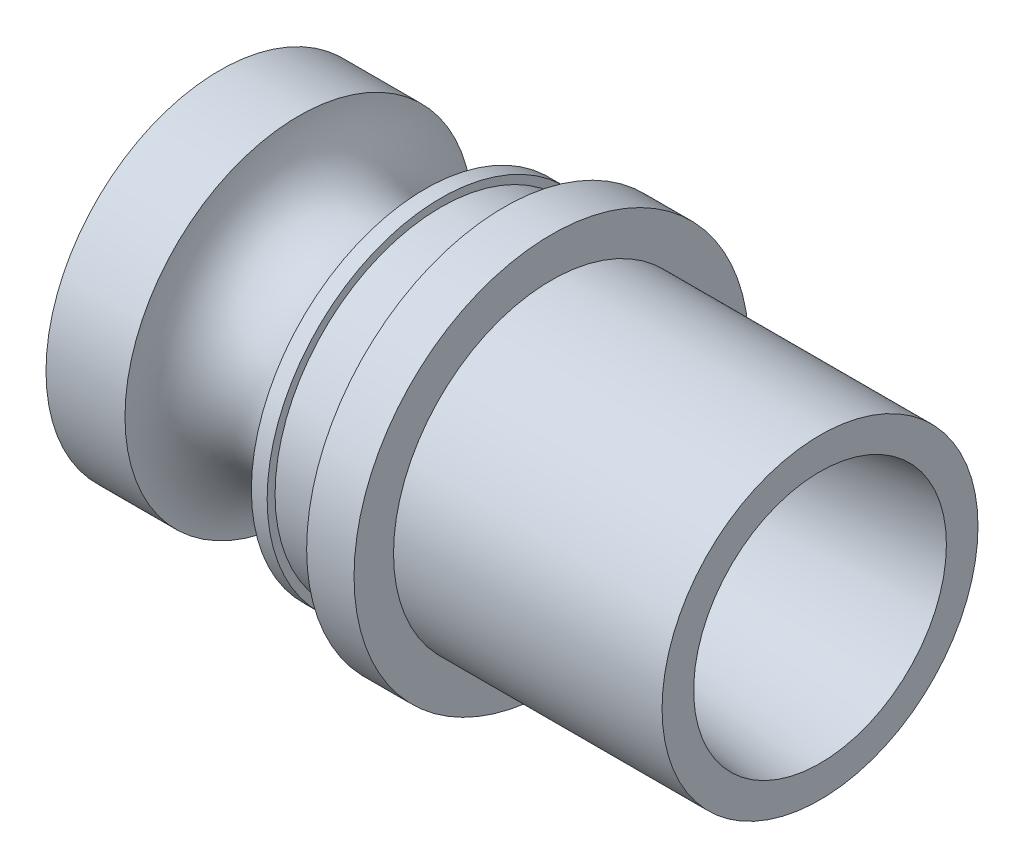
ISO-10303-21;
HEADER;
FILE_DESCRIPTION(('STEP AP214'),'2;1');
FILE_NAME('part.step','',(''),(''),'','','');
FILE_SCHEMA(('AUTOMOTIVE_DESIGN { 1 0 10303 214 1 1 1 1 }'));
ENDSEC;
DATA;
#1=APPLICATION_CONTEXT('core data for automotive mechanical design processes');
#2=APPLICATION_PROTOCOL_DEFINITION('international standard','automotive_design',2000,#1);
#3=PRODUCT_CONTEXT('',#1,'mechanical');
#4=PRODUCT('Part','Part','',(#3));
#5=PRODUCT_RELATED_PRODUCT_CATEGORY('part','',(#4));
#6=PRODUCT_DEFINITION_FORMATION('','',#4);
#7=PRODUCT_DEFINITION_CONTEXT('part definition',#1,'design');
#8=PRODUCT_DEFINITION('design','',#6,#7);
#9=PRODUCT_DEFINITION_SHAPE('','',#8);
#10=(LENGTH_UNIT() NAMED_UNIT(*) SI_UNIT(.MILLI.,.METRE.));
#11=(NAMED_UNIT(*) PLANE_ANGLE_UNIT() SI_UNIT($,.RADIAN.));
#12=(NAMED_UNIT(*) SI_UNIT($,.STERADIAN.) SOLID_ANGLE_UNIT());
#13=UNCERTAINTY_MEASURE_WITH_UNIT(LENGTH_MEASURE(1.E-05),#10,'distance_accuracy_value','');
#14=(GEOMETRIC_REPRESENTATION_CONTEXT(3) GLOBAL_UNCERTAINTY_ASSIGNED_CONTEXT((#13)) GLOBAL_UNIT_ASSIGNED_CONTEXT((#10,
#11,#12)) REPRESENTATION_CONTEXT('',''));
#15=CARTESIAN_POINT('',(0.,0.,0.));
#16=DIRECTION('',(0.,0.,1.));
#17=DIRECTION('',(1.,0.,0.));
#18=AXIS2_PLACEMENT_3D('',#15,#16,#17);
#19=CARTESIAN_POINT('',(-2.23174603174603,0.,0.));
#20=DIRECTION('',(1.,0.,0.));
#21=DIRECTION('',(0.,0.,-1.));
#22=AXIS2_PLACEMENT_3D('',#19,#20,#21);
#23=CYLINDRICAL_SURFACE('',#22,5.5);
#24=CARTESIAN_POINT('',(-14.731746031746,0.,0.));
#25=DIRECTION('',(-1.,0.,0.));
#26=DIRECTION('',(0.,0.,1.));
#27=AXIS2_PLACEMENT_3D('',#24,#25,#26);
#28=CIRCLE('',#27,5.5);
#29=CARTESIAN_POINT('',(-14.731746031746,0.,5.5));
#30=VERTEX_POINT('',#29);
#31=EDGE_CURVE('E42',#30,#30,#28,.T.);
#32=ORIENTED_EDGE('',*,*,#31,.F.);
#33=EDGE_LOOP('',(#32));
#34=FACE_BOUND('',#33,.T.);
#35=CARTESIAN_POINT('',(-14.231746031746,0.,0.));
#36=DIRECTION('',(1.,0.,0.));
#37=DIRECTION('',(0.,0.,-1.));
#38=AXIS2_PLACEMENT_3D('',#35,#36,#37);
#39=CIRCLE('',#38,5.5);
#40=CARTESIAN_POINT('',(-14.231746031746,0.,-5.5));
#41=VERTEX_POINT('',#40);
#42=EDGE_CURVE('E47',#41,#41,#39,.T.);
#43=ORIENTED_EDGE('',*,*,#42,.F.);
#44=EDGE_LOOP('',(#43));
#45=FACE_BOUND('',#44,.T.);
#46=ADVANCED_FACE('F38',(#34,#45),#23,.T.);
#47=CARTESIAN_POINT('',(-2.23174603174603,5.,0.));
#48=DIRECTION('',(1.,0.,0.));
#49=DIRECTION('',(0.,0.,-1.));
#50=AXIS2_PLACEMENT_3D('',#47,#48,#49);
#51=PLANE('',#50);
#52=CARTESIAN_POINT('',(-2.23174603174603,0.,0.));
#53=DIRECTION('',(1.,0.,0.));
#54=DIRECTION('',(0.,0.,-1.));
#55=AXIS2_PLACEMENT_3D('',#52,#53,#54);
#56=CIRCLE('',#55,4.);
#57=CARTESIAN_POINT('',(-2.23174603174603,0.,-4.));
#58=VERTEX_POINT('',#57);
#59=EDGE_CURVE('E272',#58,#58,#56,.T.);
#60=ORIENTED_EDGE('',*,*,#59,.F.);
#61=EDGE_LOOP('',(#60));
#62=FACE_BOUND('',#61,.T.);
#63=CARTESIAN_POINT('',(-2.23174603174603,0.,0.));
#64=DIRECTION('',(1.,0.,0.));
#65=DIRECTION('',(0.,0.,-1.));
#66=AXIS2_PLACEMENT_3D('',#63,#64,#65);
#67=CIRCLE('',#66,5.);
#68=CARTESIAN_POINT('',(-2.23174603174603,0.,-5.));
#69=VERTEX_POINT('',#68);
#70=EDGE_CURVE('E65',#69,#69,#67,.T.);
#71=ORIENTED_EDGE('',*,*,#70,.T.);
#72=EDGE_LOOP('',(#71));
#73=FACE_BOUND('',#72,.T.);
#74=ADVANCED_FACE('F40',(#62,#73),#51,.T.);
#75=CARTESIAN_POINT('',(-14.231746031746,5.5,0.));
#76=DIRECTION('',(1.,0.,0.));
#77=DIRECTION('',(0.,0.,-1.));
#78=AXIS2_PLACEMENT_3D('',#75,#76,#77);
#79=PLANE('',#78);
#80=ORIENTED_EDGE('',*,*,#42,.T.);
#81=EDGE_LOOP('',(#80));
#82=FACE_BOUND('',#81,.T.);
#83=CARTESIAN_POINT('',(-14.231746031746,0.,0.));
#84=DIRECTION('',(1.,0.,0.));
#85=DIRECTION('',(0.,0.,-1.));
#86=AXIS2_PLACEMENT_3D('',#83,#84,#85);
#87=CIRCLE('',#86,5.25);
#88=CARTESIAN_POINT('',(-14.231746031746,0.,-5.25));
#89=VERTEX_POINT('',#88);
#90=EDGE_CURVE('E53',#89,#89,#87,.T.);
#91=ORIENTED_EDGE('',*,*,#90,.F.);
#92=EDGE_LOOP('',(#91));
#93=FACE_BOUND('',#92,.T.);
#94=ADVANCED_FACE('F102',(#82,#93),#79,.T.);
#95=CARTESIAN_POINT('',(-2.23174603174603,0.,0.));
#96=DIRECTION('',(1.,0.,0.));
#97=DIRECTION('',(0.,0.,-1.));
#98=AXIS2_PLACEMENT_3D('',#95,#96,#97);
#99=CYLINDRICAL_SURFACE('',#98,5.25);
#100=ORIENTED_EDGE('',*,*,#90,.T.);
#101=EDGE_LOOP('',(#100));
#102=FACE_BOUND('',#101,.T.);
#103=CARTESIAN_POINT('',(-12.231746031746,0.,0.));
#104=DIRECTION('',(1.,0.,0.));
#105=DIRECTION('',(0.,0.,-1.));
#106=AXIS2_PLACEMENT_3D('',#103,#104,#105);
#107=CIRCLE('',#106,5.25);
#108=CARTESIAN_POINT('',(-12.231746031746,0.,-5.25));
#109=VERTEX_POINT('',#108);
#110=EDGE_CURVE('E92',#109,#109,#107,.T.);
#111=ORIENTED_EDGE('',*,*,#110,.F.);
#112=EDGE_LOOP('',(#111));
#113=FACE_BOUND('',#112,.T.);
#114=ADVANCED_FACE('F99',(#102,#113),#99,.T.);
#115=CARTESIAN_POINT('',(-12.231746031746,5.25,0.));
#116=DIRECTION('',(-1.,0.,0.));
#117=DIRECTION('',(0.,0.,1.));
#118=AXIS2_PLACEMENT_3D('',#115,#116,#117);
#119=PLANE('',#118);
#120=ORIENTED_EDGE('',*,*,#110,.T.);
#121=EDGE_LOOP('',(#120));
#122=FACE_BOUND('',#121,.T.);
#123=CARTESIAN_POINT('',(-12.231746031746,0.,0.));
#124=DIRECTION('',(1.,0.,0.));
#125=DIRECTION('',(0.,0.,-1.));
#126=AXIS2_PLACEMENT_3D('',#123,#124,#125);
#127=CIRCLE('',#126,6.25);
#128=CARTESIAN_POINT('',(-12.231746031746,0.,-6.25));
#129=VERTEX_POINT('',#128);
#130=EDGE_CURVE('E88',#129,#129,#127,.T.);
#131=ORIENTED_EDGE('',*,*,#130,.F.);
#132=EDGE_LOOP('',(#131));
#133=FACE_BOUND('',#132,.T.);
#134=ADVANCED_FACE('F110',(#122,#133),#119,.T.);
#135=CARTESIAN_POINT('',(-2.23174603174603,0.,0.));
#136=DIRECTION('',(1.,0.,0.));
#137=DIRECTION('',(0.,0.,-1.));
#138=AXIS2_PLACEMENT_3D('',#135,#136,#137);
#139=CYLINDRICAL_SURFACE('',#138,6.25);
#140=ORIENTED_EDGE('',*,*,#130,.T.);
#141=EDGE_LOOP('',(#140));
#142=FACE_BOUND('',#141,.T.);
#143=CARTESIAN_POINT('',(-10.731746031746,0.,0.));
#144=DIRECTION('',(1.,0.,0.));
#145=DIRECTION('',(0.,0.,-1.));
#146=AXIS2_PLACEMENT_3D('',#143,#144,#145);
#147=CIRCLE('',#146,6.25);
#148=CARTESIAN_POINT('',(-10.731746031746,0.,-6.25));
#149=VERTEX_POINT('',#148);
#150=EDGE_CURVE('E84',#149,#149,#147,.T.);
#151=ORIENTED_EDGE('',*,*,#150,.F.);
#152=EDGE_LOOP('',(#151));
#153=FACE_BOUND('',#152,.T.);
#154=ADVANCED_FACE('F159',(#142,#153),#139,.T.);
#155=CARTESIAN_POINT('',(-10.731746031746,6.25,0.));
#156=DIRECTION('',(1.,0.,0.));
#157=DIRECTION('',(0.,0.,-1.));
#158=AXIS2_PLACEMENT_3D('',#155,#156,#157);
#159=PLANE('',#158);
#160=ORIENTED_EDGE('',*,*,#150,.T.);
#161=EDGE_LOOP('',(#160));
#162=FACE_BOUND('',#161,.T.);
#163=CARTESIAN_POINT('',(-10.731746031746,0.,0.));
#164=DIRECTION('',(1.,0.,0.));
#165=DIRECTION('',(0.,0.,-1.));
#166=AXIS2_PLACEMENT_3D('',#163,#164,#165);
#167=CIRCLE('',#166,5.);
#168=CARTESIAN_POINT('',(-10.731746031746,0.,-5.));
#169=VERTEX_POINT('',#168);
#170=EDGE_CURVE('E80',#169,#169,#167,.T.);
#171=ORIENTED_EDGE('',*,*,#170,.F.);
#172=EDGE_LOOP('',(#171));
#173=FACE_BOUND('',#172,.T.);
#174=ADVANCED_FACE('F155',(#162,#173),#159,.T.);
#175=CARTESIAN_POINT('',(-2.23174603174603,0.,0.));
#176=DIRECTION('',(1.,0.,0.));
#177=DIRECTION('',(0.,0.,-1.));
#178=AXIS2_PLACEMENT_3D('',#175,#176,#177);
#179=CYLINDRICAL_SURFACE('',#178,5.);
#180=ORIENTED_EDGE('',*,*,#170,.T.);
#181=EDGE_LOOP('',(#180));
#182=FACE_BOUND('',#181,.T.);
#183=ORIENTED_EDGE('',*,*,#70,.F.);
#184=EDGE_LOOP('',(#183));
#185=FACE_BOUND('',#184,.T.);
#186=ADVANCED_FACE('F152',(#182,#185),#179,.T.);
#187=CARTESIAN_POINT('',(-16.731746031746,0.,0.));
#188=DIRECTION('',(1.,0.,0.));
#189=DIRECTION('',(0.,0.,-1.));
#190=AXIS2_PLACEMENT_3D('',#187,#188,#189);
#191=TOROIDAL_SURFACE('',#190,5.5,2.);
#192=ORIENTED_EDGE('',*,*,#31,.T.);
#193=EDGE_LOOP('',(#192));
#194=FACE_BOUND('',#193,.T.);
#195=CARTESIAN_POINT('',(-18.731746031746,0.,0.));
#196=DIRECTION('',(1.,0.,0.));
#197=DIRECTION('',(0.,0.,-1.));
#198=AXIS2_PLACEMENT_3D('',#195,#196,#197);
#199=CIRCLE('',#198,5.5);
#200=CARTESIAN_POINT('',(-18.731746031746,0.,-5.5));
#201=VERTEX_POINT('',#200);
#202=EDGE_CURVE('E56',#201,#201,#199,.T.);
#203=ORIENTED_EDGE('',*,*,#202,.T.);
#204=EDGE_LOOP('',(#203));
#205=FACE_BOUND('',#204,.T.);
#206=ADVANCED_FACE('F143',(#194,#205),#191,.F.);
#207=CARTESIAN_POINT('',(-21.8472926980596,0.,0.));
#208=DIRECTION('',(1.,0.,0.));
#209=DIRECTION('',(0.,0.,-1.));
#210=AXIS2_PLACEMENT_3D('',#207,#208,#209);
#211=DEGENERATE_TOROIDAL_SURFACE('',#210,0.0773120453172603,5.,.T.);
#212=CARTESIAN_POINT('',(-21.231746031746,0.,0.));
#213=DIRECTION('',(1.,0.,0.));
#214=DIRECTION('',(0.,0.,-1.));
#215=AXIS2_PLACEMENT_3D('',#212,#213,#214);
#216=CIRCLE('',#215,5.03927761367727);
#217=CARTESIAN_POINT('',(-21.231746031746,0.,-5.03927761367727));
#218=VERTEX_POINT('',#217);
#219=EDGE_CURVE('E59',#218,#218,#216,.T.);
#220=ORIENTED_EDGE('',*,*,#219,.F.);
#221=EDGE_LOOP('',(#220));
#222=FACE_BOUND('',#221,.T.);
#223=CARTESIAN_POINT('',(-17.231746031746,0.,0.));
#224=DIRECTION('',(1.,0.,0.));
#225=DIRECTION('',(0.,0.,-1.));
#226=AXIS2_PLACEMENT_3D('',#223,#224,#225);
#227=CIRCLE('',#226,2.);
#228=CARTESIAN_POINT('',(-17.231746031746,0.,-2.));
#229=VERTEX_POINT('',#228);
#230=EDGE_CURVE('E67',#229,#229,#227,.T.);
#231=ORIENTED_EDGE('',*,*,#230,.T.);
#232=EDGE_LOOP('',(#231));
#233=FACE_BOUND('',#232,.T.);
#234=ADVANCED_FACE('F147',(#222,#233),#211,.F.);
#235=CARTESIAN_POINT('',(-2.23174603174603,0.,0.));
#236=DIRECTION('',(1.,0.,0.));
#237=DIRECTION('',(0.,0.,-1.));
#238=AXIS2_PLACEMENT_3D('',#235,#236,#237);
#239=CYLINDRICAL_SURFACE('',#238,2.);
#240=ORIENTED_EDGE('',*,*,#230,.F.);
#241=EDGE_LOOP('',(#240));
#242=FACE_BOUND('',#241,.T.);
#243=CARTESIAN_POINT('',(-15.6088228534803,0.,0.));
#244=DIRECTION('',(1.,0.,0.));
#245=DIRECTION('',(0.,0.,-1.));
#246=AXIS2_PLACEMENT_3D('',#243,#244,#245);
#247=CIRCLE('',#246,2.);
#248=CARTESIAN_POINT('',(-15.6088228534803,0.,-2.));
#249=VERTEX_POINT('',#248);
#250=EDGE_CURVE('E73',#249,#249,#247,.T.);
#251=ORIENTED_EDGE('',*,*,#250,.T.);
#252=EDGE_LOOP('',(#251));
#253=FACE_BOUND('',#252,.T.);
#254=ADVANCED_FACE('F137',(#242,#253),#239,.F.);
#255=CARTESIAN_POINT('',(-15.231746031746,0.,0.));
#256=DIRECTION('',(1.,0.,0.));
#257=DIRECTION('',(0.,0.,-1.));
#258=AXIS2_PLACEMENT_3D('',#255,#256,#257);
#259=CONICAL_SURFACE('',#258,2.5188370920787,0.94232692660653);
#260=ORIENTED_EDGE('',*,*,#250,.F.);
#261=EDGE_LOOP('',(#260));
#262=FACE_BOUND('',#261,.T.);
#263=CARTESIAN_POINT('',(-15.231746031746,0.,0.));
#264=DIRECTION('',(1.,0.,0.));
#265=DIRECTION('',(0.,0.,-1.));
#266=AXIS2_PLACEMENT_3D('',#263,#264,#265);
#267=CIRCLE('',#266,2.5188370920787);
#268=CARTESIAN_POINT('',(-15.231746031746,0.,-2.5188370920787));
#269=VERTEX_POINT('',#268);
#270=EDGE_CURVE('E269',#269,#269,#267,.T.);
#271=ORIENTED_EDGE('',*,*,#270,.T.);
#272=EDGE_LOOP('',(#271));
#273=FACE_BOUND('',#272,.T.);
#274=ADVANCED_FACE('F131',(#262,#273),#259,.F.);
#275=CARTESIAN_POINT('',(-2.23174603174603,0.,0.));
#276=DIRECTION('',(1.,0.,0.));
#277=DIRECTION('',(0.,0.,-1.));
#278=AXIS2_PLACEMENT_3D('',#275,#276,#277);
#279=CONICAL_SURFACE('',#278,4.,0.113446401379625);
#280=ORIENTED_EDGE('',*,*,#270,.F.);
#281=EDGE_LOOP('',(#280));
#282=FACE_BOUND('',#281,.T.);
#283=ORIENTED_EDGE('',*,*,#59,.T.);
#284=EDGE_LOOP('',(#283));
#285=FACE_BOUND('',#284,.T.);
#286=ADVANCED_FACE('F125',(#282,#285),#279,.F.);
#287=ORIENTED_EDGE('',*,*,#202,.F.);
#288=EDGE_LOOP('',(#287));
#289=FACE_BOUND('',#288,.T.);
#290=CARTESIAN_POINT('',(-21.231746031746,0.,0.));
#291=DIRECTION('',(1.,0.,0.));
#292=DIRECTION('',(0.,0.,-1.));
#293=AXIS2_PLACEMENT_3D('',#290,#291,#292);
#294=CIRCLE('',#293,5.5);
#295=CARTESIAN_POINT('',(-21.231746031746,0.,-5.5));
#296=VERTEX_POINT('',#295);
#297=EDGE_CURVE('E10',#296,#296,#294,.T.);
#298=ORIENTED_EDGE('',*,*,#297,.T.);
#299=EDGE_LOOP('',(#298));
#300=FACE_BOUND('',#299,.T.);
#301=ADVANCED_FACE('F117',(#289,#300),#23,.T.);
#302=CARTESIAN_POINT('',(-21.231746031746,0.,0.));
#303=DIRECTION('',(-1.,0.,0.));
#304=DIRECTION('',(0.,0.,1.));
#305=AXIS2_PLACEMENT_3D('',#302,#303,#304);
#306=PLANE('',#305);
#307=ORIENTED_EDGE('',*,*,#219,.T.);
#308=EDGE_LOOP('',(#307));
#309=FACE_BOUND('',#308,.T.);
#310=ORIENTED_EDGE('',*,*,#297,.F.);
#311=EDGE_LOOP('',(#310));
#312=FACE_BOUND('',#311,.T.);
#313=ADVANCED_FACE('F124',(#309,#312),#306,.T.);
#314=CLOSED_SHELL('',(#46,#74,#94,#114,#134,#154,#174,#186,#206,#234,#254,#274,#286,#301,#313));
#315=MANIFOLD_SOLID_BREP('B2',#314);
#316=ADVANCED_BREP_SHAPE_REPRESENTATION('',(#18,#315),#14);
#317=SHAPE_DEFINITION_REPRESENTATION(#9,#316);
ENDSEC;
END-ISO-10303-21;
